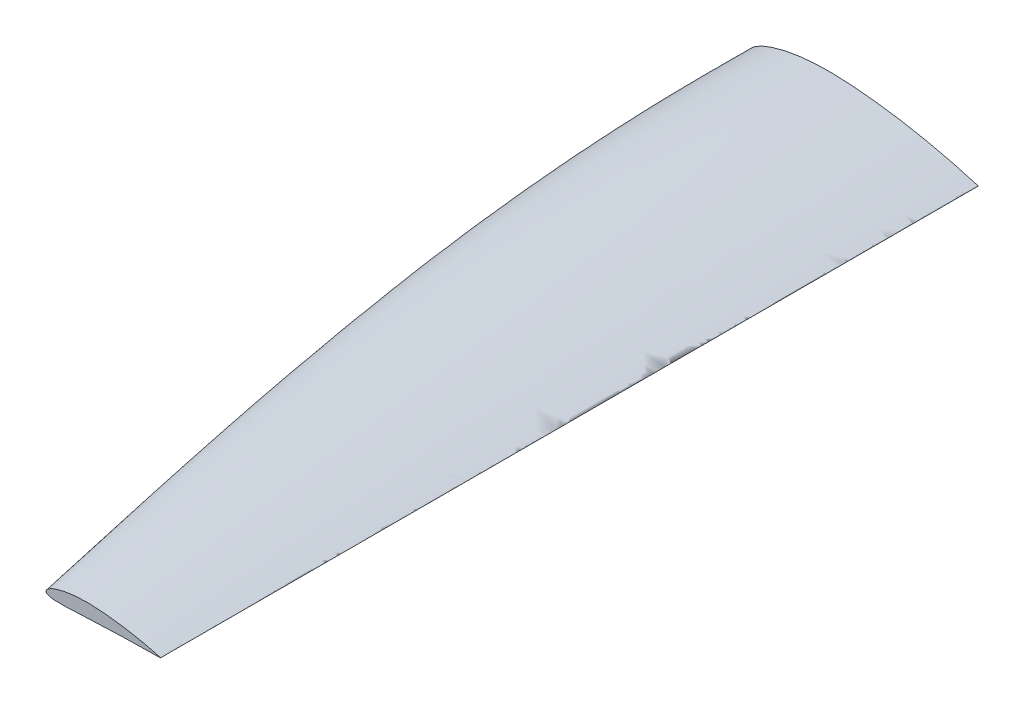
ISO-10303-21;
HEADER;
FILE_DESCRIPTION(('STEP AP214'),'2;1');
FILE_NAME('part.step','',(''),(''),'','','');
FILE_SCHEMA(('AUTOMOTIVE_DESIGN { 1 0 10303 214 1 1 1 1 }'));
ENDSEC;
DATA;
#1=APPLICATION_CONTEXT('core data for automotive mechanical design processes');
#2=APPLICATION_PROTOCOL_DEFINITION('international standard','automotive_design',2000,#1);
#3=PRODUCT_CONTEXT('',#1,'mechanical');
#4=PRODUCT('Part','Part','',(#3));
#5=PRODUCT_RELATED_PRODUCT_CATEGORY('part','',(#4));
#6=PRODUCT_DEFINITION_FORMATION('','',#4);
#7=PRODUCT_DEFINITION_CONTEXT('part definition',#1,'design');
#8=PRODUCT_DEFINITION('design','',#6,#7);
#9=PRODUCT_DEFINITION_SHAPE('','',#8);
#10=(LENGTH_UNIT() NAMED_UNIT(*) SI_UNIT(.MILLI.,.METRE.));
#11=(NAMED_UNIT(*) PLANE_ANGLE_UNIT() SI_UNIT($,.RADIAN.));
#12=(NAMED_UNIT(*) SI_UNIT($,.STERADIAN.) SOLID_ANGLE_UNIT());
#13=UNCERTAINTY_MEASURE_WITH_UNIT(LENGTH_MEASURE(1.E-05),#10,'distance_accuracy_value','');
#14=(GEOMETRIC_REPRESENTATION_CONTEXT(3) GLOBAL_UNCERTAINTY_ASSIGNED_CONTEXT((#13)) GLOBAL_UNIT_ASSIGNED_CONTEXT((#10,
#11,#12)) REPRESENTATION_CONTEXT('',''));
#15=CARTESIAN_POINT('',(0.,0.,0.));
#16=DIRECTION('',(0.,0.,1.));
#17=DIRECTION('',(1.,0.,0.));
#18=AXIS2_PLACEMENT_3D('',#15,#16,#17);
#19=CARTESIAN_POINT('',(0.415671823278239,2.29801966455142,0.));
#20=DIRECTION('',(0.,0.,-1.));
#21=DIRECTION('',(-1.,0.,0.));
#22=AXIS2_PLACEMENT_3D('',#19,#20,#21);
#23=PLANE('',#22);
#24=CARTESIAN_POINT('',(140.02716,0.20398,0.));
#25=CARTESIAN_POINT('',(139.956789164407,0.225221614482339,0.));
#26=CARTESIAN_POINT('',(139.675665524009,0.310079495461963,0.));
#27=CARTESIAN_POINT('',(139.044498575236,0.499628042540923,0.));
#28=CARTESIAN_POINT('',(137.996224381688,0.811560707731416,0.));
#29=CARTESIAN_POINT('',(136.536433819815,1.24004769538334,0.));
#30=CARTESIAN_POINT('',(134.672905149545,1.77703214134827,0.));
#31=CARTESIAN_POINT('',(132.415637549044,2.41285187336849,0.));
#32=CARTESIAN_POINT('',(129.776846288305,3.13588639968204,0.));
#33=CARTESIAN_POINT('',(126.771112785758,3.93369295315949,0.));
#34=CARTESIAN_POINT('',(123.415248342765,4.79279186121189,0.));
#35=CARTESIAN_POINT('',(119.728052254295,5.69839562087959,0.));
#36=CARTESIAN_POINT('',(115.730741779321,6.63628033170199,0.));
#37=CARTESIAN_POINT('',(111.446385502148,7.59123371500353,0.));
#38=CARTESIAN_POINT('',(106.900008862267,8.54811777631246,0.));
#39=CARTESIAN_POINT('',(102.11855960554,9.49244534886887,0.));
#40=CARTESIAN_POINT('',(97.1306342164976,10.4094157862568,0.));
#41=CARTESIAN_POINT('',(91.9664102677575,11.2849755639074,0.));
#42=CARTESIAN_POINT('',(86.6574126094523,12.1050385678699,0.));
#43=CARTESIAN_POINT('',(81.236388980716,12.8570299790795,0.));
#44=CARTESIAN_POINT('',(75.7371009401458,13.5278385740999,0.));
#45=CARTESIAN_POINT('',(70.1942324093874,14.1062599715892,0.));
#46=CARTESIAN_POINT('',(64.6430465460116,14.5819773965765,0.));
#47=CARTESIAN_POINT('',(59.1044988145988,14.9449603694939,0.));
#48=CARTESIAN_POINT('',(53.5949828455513,15.1933641453371,0.));
#49=CARTESIAN_POINT('',(48.1486500652942,15.2539109214711,0.));
#50=CARTESIAN_POINT('',(42.8194940736059,15.1314064960747,0.));
#51=CARTESIAN_POINT('',(37.6645384335811,14.8278117397698,0.));
#52=CARTESIAN_POINT('',(32.721013927537,14.3505845804176,0.));
#53=CARTESIAN_POINT('',(28.0243854111276,13.7112812989703,0.));
#54=CARTESIAN_POINT('',(23.608012874332,12.9240931556622,0.));
#55=CARTESIAN_POINT('',(19.5026211339542,12.0062678345121,0.));
#56=CARTESIAN_POINT('',(15.7359111417993,10.9777061910959,0.));
#57=CARTESIAN_POINT('',(12.3325411815223,9.85913447746707,0.));
#58=CARTESIAN_POINT('',(9.31318480721374,8.67337607412427,0.));
#59=CARTESIAN_POINT('',(6.69490403739945,7.44244006941027,0.));
#60=CARTESIAN_POINT('',(4.4905558444516,6.18766147729643,0.));
#61=CARTESIAN_POINT('',(2.70840114542649,4.92797980027153,0.));
#62=CARTESIAN_POINT('',(1.35228918277038,3.67677063274474,0.));
#63=CARTESIAN_POINT('',(0.422250394410197,2.43914829508015,0.));
#64=CARTESIAN_POINT('',(-0.0704433076460615,1.20187014734243,0.));
#65=CARTESIAN_POINT('',(-0.077377808805779,-0.0155425075349178,0.));
#66=CARTESIAN_POINT('',(0.396195143578908,-1.13486449084059,0.));
#67=CARTESIAN_POINT('',(1.31323794825806,-2.08980898964254,0.));
#68=CARTESIAN_POINT('',(2.61664142607889,-2.89089635641442,0.));
#69=CARTESIAN_POINT('',(4.29704123511491,-3.56317367775761,0.));
#70=CARTESIAN_POINT('',(6.3480018888662,-4.11610254754229,0.));
#71=CARTESIAN_POINT('',(8.75913079835625,-4.55450469711747,0.));
#72=CARTESIAN_POINT('',(11.5160065683426,-4.8826500983735,0.));
#73=CARTESIAN_POINT('',(14.6016276176691,-5.10580988203923,0.));
#74=CARTESIAN_POINT('',(17.9973187831287,-5.23050109456169,0.));
#75=CARTESIAN_POINT('',(21.6830590843005,-5.26478673798973,0.));
#76=CARTESIAN_POINT('',(25.6380804310704,-5.2188970225612,0.));
#77=CARTESIAN_POINT('',(29.840828227253,-5.10415692979439,0.));
#78=CARTESIAN_POINT('',(34.2692146276758,-4.93322913419527,0.));
#79=CARTESIAN_POINT('',(38.9004770271151,-4.72015951338447,0.));
#80=CARTESIAN_POINT('',(43.711199328192,-4.47993319920713,0.));
#81=CARTESIAN_POINT('',(48.6771365915648,-4.22752148181516,0.));
#82=CARTESIAN_POINT('',(53.791929218503,-3.97517312980894,0.));
#83=CARTESIAN_POINT('',(59.0435545788623,-3.74433201324976,0.));
#84=CARTESIAN_POINT('',(64.3997997730417,-3.4807902478649,0.));
#85=CARTESIAN_POINT('',(69.8108585871143,-3.201291868649,0.));
#86=CARTESIAN_POINT('',(75.2301020814417,-2.91426609005164,0.));
#87=CARTESIAN_POINT('',(80.6251958246626,-2.6275528848076,0.));
#88=CARTESIAN_POINT('',(85.9636812748627,-2.34795621616198,0.));
#89=CARTESIAN_POINT('',(91.2130148357345,-2.0804474575052,0.));
#90=CARTESIAN_POINT('',(96.3409170930741,-1.82925450909069,0.));
#91=CARTESIAN_POINT('',(101.315399411902,-1.59671187508793,0.));
#92=CARTESIAN_POINT('',(106.10523935564,-1.38436743609644,0.));
#93=CARTESIAN_POINT('',(110.679963839704,-1.19288029389329,0.));
#94=CARTESIAN_POINT('',(115.010291079431,-1.02158789581474,0.));
#95=CARTESIAN_POINT('',(119.068135991926,-0.869967551339208,0.));
#96=CARTESIAN_POINT('',(122.827026690065,-0.736722937412343,0.));
#97=CARTESIAN_POINT('',(126.262097544598,-0.620892102779046,0.));
#98=CARTESIAN_POINT('',(129.350471616447,-0.521024926129598,0.));
#99=CARTESIAN_POINT('',(132.071299286858,-0.436344517829494,0.));
#100=CARTESIAN_POINT('',(134.406136442625,-0.365638747434759,0.));
#101=CARTESIAN_POINT('',(136.33894196305,-0.308592109231638,0.));
#102=CARTESIAN_POINT('',(137.856451785526,-0.264409061113069,0.));
#103=CARTESIAN_POINT('',(138.948036515316,-0.233117796124669,0.));
#104=CARTESIAN_POINT('',(139.606087823228,-0.214473895954195,0.));
#105=CARTESIAN_POINT('',(139.899386715742,-0.206081722010989,0.));
#106=CARTESIAN_POINT('',(139.97284,-0.20398,0.));
#107=B_SPLINE_CURVE_WITH_KNOTS('',3,(#24,#25,#26,#27,#28,#29,#30,#31,#32,#33,#34,#35,#36,#37,
#38,#39,#40,#41,#42,#43,#44,#45,#46,#47,#48,#49,#50,#51,#52,#53,#54,#55,#56,#57,#58,#59,#60,#61,
#62,#63,#64,#65,#66,#67,#68,#69,#70,#71,#72,#73,#74,#75,#76,#77,#78,#79,#80,#81,#82,#83,#84,#85,
#86,#87,#88,#89,#90,#91,#92,#93,#94,#95,#96,#97,#98,#99,#100,#101,#102,#103,#104,#105,#106),
.UNSPECIFIED.,.F.,.F.,(4,1,1,1,1,1,1,1,1,1,1,1,1,1,1,1,1,1,1,1,1,1,1,1,1,1,1,1,1,1,1,1,1,1,1,1,
1,1,1,1,1,1,1,1,1,1,1,1,1,1,1,1,1,1,1,1,1,1,1,1,1,1,1,1,1,1,1,1,1,1,1,1,1,1,1,1,1,1,1,1,4),(0.,
0.000765130769244524,0.00305661209529914,0.00685965866343209,0.0121494072683618,
0.0188925332976978,0.0270462263354811,0.036559370649623,0.0473717724666816,0.0594157806242667,
0.0726163879325896,0.0868916573026751,0.10215276829467,0.118305464017637,0.135250369014953,
0.152882702447659,0.171093067984952,0.189769869151045,0.208797162579736,0.22805825047004,
0.247433292879836,0.266802990255714,0.286048293434919,0.305204432528419,0.324202365555451,
0.342730632005811,0.36067914332664,0.377940972438308,0.394414282166585,0.410003847372115,
0.424621473054428,0.438187350081377,0.450630882305105,0.461893566430374,0.471931937961665,
0.480721044479205,0.488262835911895,0.494602302954352,0.499854540793154,0.504257180365687,
0.508228707867405,0.512199847689362,0.51658892059262,0.521790216513113,0.528017933142941,
0.535367185905355,0.54386649047139,0.553505568972509,0.564252677358332,0.576059862122198,
0.58886938605381,0.602615469366401,0.617228103730882,0.632630671763226,0.648744088065116,
0.665485527558587,0.68276768508984,0.700501138454311,0.718789846760451,0.737484301576945,
0.75632139416763,0.77518847252562,0.793972092477878,0.812558003919144,0.830832750700832,
0.848683119557139,0.865998140681247,0.882668481494707,0.898589333210652,0.913657957121903,
0.927777935623076,0.940856759647301,0.952808686344022,0.963553789330579,0.973020343249466,
0.981143405483448,0.987868175453762,0.993147615856128,0.996945811456687,0.999235114127682,1.),.UNSPECIFIED.);
#108=CARTESIAN_POINT('',(140.02716,0.20398,0.));
#109=VERTEX_POINT('',#108);
#110=CARTESIAN_POINT('',(0.411412429813606,2.29017223411874,0.));
#111=VERTEX_POINT('',#110);
#112=EDGE_CURVE('E107',#109,#111,#107,.T.);
#113=ORIENTED_EDGE('',*,*,#112,.F.);
#114=CARTESIAN_POINT('',(139.966917755284,0.00440491110149645,0.));
#115=DIRECTION('',(0.,0.,1.));
#116=DIRECTION('',(1.,0.,0.));
#117=AXIS2_PLACEMENT_3D('',#114,#115,#116);
#118=CIRCLE('',#117,0.208469048439458);
#119=CARTESIAN_POINT('',(139.97284,-0.20398,0.));
#120=VERTEX_POINT('',#119);
#121=EDGE_CURVE('E12',#120,#109,#118,.T.);
#122=ORIENTED_EDGE('',*,*,#121,.F.);
#123=EDGE_CURVE('E141',#111,#120,#107,.T.);
#124=ORIENTED_EDGE('',*,*,#123,.F.);
#125=EDGE_LOOP('',(#113,#122,#124));
#126=FACE_BOUND('',#125,.T.);
#127=ADVANCED_FACE('F97',(#126),#23,.T.);
#128=CARTESIAN_POINT('',(70.2070508347638,0.921900595099988,500.));
#129=DIRECTION('',(0.,0.,-1.));
#130=DIRECTION('',(-1.,0.,0.));
#131=AXIS2_PLACEMENT_3D('',#128,#129,#130);
#132=PLANE('',#131);
#133=CARTESIAN_POINT('',(139.991690010155,0.0954049111014893,500.));
#134=CARTESIAN_POINT('',(138.826226199171,0.412670477784435,500.));
#135=CARTESIAN_POINT('',(136.500922951398,1.04567052949012,500.));
#136=CARTESIAN_POINT('',(131.84266656573,2.19662076893469,500.));
#137=CARTESIAN_POINT('',(126.017356406259,3.46828079525896,500.));
#138=CARTESIAN_POINT('',(119.010615610135,4.72183337190155,500.));
#139=CARTESIAN_POINT('',(112.009306596785,5.74935607308087,500.));
#140=CARTESIAN_POINT('',(105.004096516577,6.48228745980126,500.));
#141=CARTESIAN_POINT('',(97.9994968079689,6.93940968050786,500.));
#142=CARTESIAN_POINT('',(92.1519728350144,6.94403278194451,500.));
#143=CARTESIAN_POINT('',(87.4830557257147,6.62102156808662,500.));
#144=CARTESIAN_POINT('',(83.9766368401042,6.19555764960619,500.));
#145=CARTESIAN_POINT('',(80.4626396313168,5.56812181580328,500.));
#146=CARTESIAN_POINT('',(77.5507139927825,4.81354122844692,500.));
#147=CARTESIAN_POINT('',(75.2172346664348,4.05144626835453,500.));
#148=CARTESIAN_POINT('',(73.4577373117885,3.33199340289161,500.));
#149=CARTESIAN_POINT('',(71.956438297883,2.55392412828517,500.));
#150=CARTESIAN_POINT('',(70.653309522438,1.62321606752932,500.));
#151=CARTESIAN_POINT('',(69.5189274646735,0.126342995005206,500.));
#152=CARTESIAN_POINT('',(70.7433436229241,-1.0184347501925,500.));
#153=CARTESIAN_POINT('',(71.9927392558483,-1.46780258624416,500.));
#154=CARTESIAN_POINT('',(73.4806835291226,-1.77110609035672,500.));
#155=CARTESIAN_POINT('',(75.2379420284311,-1.92531408335775,500.));
#156=CARTESIAN_POINT('',(77.5740531760367,-2.0344501162058,500.));
#157=CARTESIAN_POINT('',(80.4924205235268,-2.02627575318249,500.));
#158=CARTESIAN_POINT('',(83.9932091133849,-1.92831199445039,500.));
#159=CARTESIAN_POINT('',(87.4915275698006,-1.74178242167589,500.));
#160=CARTESIAN_POINT('',(92.1582125342315,-1.52352499743364,500.));
#161=CARTESIAN_POINT('',(97.9905725641301,-1.24344192758375,500.));
#162=CARTESIAN_POINT('',(104.991891895179,-0.980441739602082,500.));
#163=CARTESIAN_POINT('',(111.990962082237,-0.688402450579421,500.));
#164=CARTESIAN_POINT('',(118.990701977773,-0.439659860819063,500.));
#165=CARTESIAN_POINT('',(125.991002641338,-0.256694079996228,500.));
#166=CARTESIAN_POINT('',(131.824848171958,-0.163797089782725,500.));
#167=CARTESIAN_POINT('',(136.491583614441,-0.102619622635028,500.));
#168=CARTESIAN_POINT('',(138.825008877188,-0.0919365040045917,500.));
#169=CARTESIAN_POINT('',(139.991690010155,-0.0865950888984963,500.));
#170=B_SPLINE_CURVE_WITH_KNOTS('',3,(#133,#134,#135,#136,#137,#138,#139,#140,#141,#142,#143,
#144,#145,#146,#147,#148,#149,#150,#151,#152,#153,#154,#155,#156,#157,#158,#159,#160,#161,#162,
#163,#164,#165,#166,#167,#168,#169),.UNSPECIFIED.,.F.,.F.,(4,1,1,1,1,1,1,1,1,1,1,1,1,1,1,1,1,1,
1,1,1,1,1,1,1,1,1,1,1,1,1,1,1,1,4),(0.,0.0253048857109568,0.0504876533905407,0.100520432651506,
0.150190715723339,0.199586606894546,0.248740009224029,0.297715538989186,0.346600594361287,
0.371102737044854,0.395726297170324,0.420570145356384,0.445825119255769,0.458702215791061,
0.471919981785349,0.485786002851729,0.493461050828321,0.506863029175844,0.516147770049506,
0.522766002591757,0.535269014058866,0.54755113395783,0.559786370715185,0.584228898401235,
0.608680810066395,0.633151283581104,0.657621757095813,0.706558114036031,0.755481870433228,
0.804405626830425,0.853320223819576,0.902221408341012,0.951113135961066,0.975557227893806,1.),.UNSPECIFIED.);
#171=CARTESIAN_POINT('',(139.991690010155,0.0954049111014926,500.));
#172=VERTEX_POINT('',#171);
#173=CARTESIAN_POINT('',(70.229202467087,0.958305058133424,500.));
#174=VERTEX_POINT('',#173);
#175=EDGE_CURVE('E149',#172,#174,#170,.T.);
#176=ORIENTED_EDGE('',*,*,#175,.T.);
#177=CARTESIAN_POINT('',(139.991690010155,-0.0865950888984997,500.));
#178=VERTEX_POINT('',#177);
#179=EDGE_CURVE('E138',#174,#178,#170,.T.);
#180=ORIENTED_EDGE('',*,*,#179,.T.);
#181=CARTESIAN_POINT('',(139.966917755284,0.00440491110149645,500.));
#182=DIRECTION('',(0.,0.,1.));
#183=DIRECTION('',(1.,0.,0.));
#184=AXIS2_PLACEMENT_3D('',#181,#182,#183);
#185=CIRCLE('',#184,0.0943115295781594);
#186=EDGE_CURVE('E146',#178,#172,#185,.T.);
#187=ORIENTED_EDGE('',*,*,#186,.T.);
#188=EDGE_LOOP('',(#176,#180,#187));
#189=FACE_BOUND('',#188,.T.);
#190=ADVANCED_FACE('F157',(#189),#132,.F.);
#191=CARTESIAN_POINT('',(70.229202467087,0.958305058133424,500.));
#192=CARTESIAN_POINT('',(36.2046741632112,1.60736817517169,346.235262809342));
#193=CARTESIAN_POINT('',(-0.618435955305731,2.30981796137034,179.823085119535));
#194=CARTESIAN_POINT('',(0.338671594634367,2.29155986226734,12.7013661283614));
#195=CARTESIAN_POINT('',(0.411412429813606,2.29017223411874,0.));
#196=CARTESIAN_POINT('',(70.2782998015312,1.03770981875317,500.));
#197=CARTESIAN_POINT('',(36.2728825393325,1.72882028354048,346.235262809341));
#198=CARTESIAN_POINT('',(-0.529544618178424,2.47677589137837,179.823085119535));
#199=CARTESIAN_POINT('',(0.42702533952489,2.45733500338771,12.7013661283614));
#200=CARTESIAN_POINT('',(0.499725317322645,2.45585748246631,0.));
#201=CARTESIAN_POINT('',(70.3848431585398,1.1911445888186,500.));
#202=CARTESIAN_POINT('',(36.4223219029815,1.96397379063561,346.235262809341));
#203=CARTESIAN_POINT('',(-0.333680970199578,2.80036965620507,179.823085119535));
#204=CARTESIAN_POINT('',(0.621682325902105,2.77863002598104,12.7013661283614));
#205=CARTESIAN_POINT('',(0.694290596584305,2.77697779906142,0.));
#206=CARTESIAN_POINT('',(70.6235984634688,1.47841747586088,500.));
#207=CARTESIAN_POINT('',(36.7622058985501,2.40584772455573,346.235262809341));
#208=CARTESIAN_POINT('',(0.115649742111272,3.40956086555595,179.823085119535));
#209=CARTESIAN_POINT('',(1.06816829537149,3.38347231893038,12.7013661283614));
#210=CARTESIAN_POINT('',(1.14056036363195,3.38148957135904,0.));
#211=CARTESIAN_POINT('',(70.9554526420563,1.80768321475091,500.));
#212=CARTESIAN_POINT('',(37.2430421208917,2.91141458797067,346.235262809342));
#213=CARTESIAN_POINT('',(0.757722063123896,4.10592995448357,179.823085119535));
#214=CARTESIAN_POINT('',(1.70604976213893,4.07488206982284,12.7013661283614));
#215=CARTESIAN_POINT('',(1.77812332258078,4.07252240913381,0.));
#216=CARTESIAN_POINT('',(71.3955978319423,2.15497504855435,499.999999999999));
#217=CARTESIAN_POINT('',(37.8797469829841,3.45350800704475,346.235262809341));
#218=CARTESIAN_POINT('',(1.6071540022788,4.85884775770834,179.823085119535));
#219=CARTESIAN_POINT('',(2.54995249175998,4.82232011837365,12.7013661283614));
#220=CARTESIAN_POINT('',(2.62160582845645,4.81954399254275,0.));
#221=CARTESIAN_POINT('',(71.8655041793206,2.46013808728523,500.));
#222=CARTESIAN_POINT('',(38.5577776365189,3.9422480503331,346.235262809342));
#223=CARTESIAN_POINT('',(2.51042757984461,5.54626436143786,179.823085119535));
#224=CARTESIAN_POINT('',(3.44737154746529,5.50457271408258,12.7013661283614));
#225=CARTESIAN_POINT('',(3.51857993645475,5.50140412007368,0.));
#226=CARTESIAN_POINT('',(72.3487042791655,2.74309618260897,500.));
#227=CARTESIAN_POINT('',(39.2612225484475,4.39316593948097,346.235262809341));
#228=CARTESIAN_POINT('',(3.45223285627134,6.17895705516884,179.823085119535));
#229=CARTESIAN_POINT('',(4.38298135306586,6.13254071081498,12.7013661283613));
#230=CARTESIAN_POINT('',(4.45371888199132,6.1290130365693,0.));
#231=CARTESIAN_POINT('',(72.8436759051862,3.00518095133652,500.));
#232=CARTESIAN_POINT('',(39.9844704090411,4.8118253667572,346.235262809342));
#233=CARTESIAN_POINT('',(4.42253310354455,6.76706970283991,179.823085119535));
#234=CARTESIAN_POINT('',(5.34686020617218,6.71624892452923,12.7013661283614));
#235=CARTESIAN_POINT('',(5.41710970470362,6.71238651025927,0.));
#236=CARTESIAN_POINT('',(73.3469083408627,3.25072178685246,500.));
#237=CARTESIAN_POINT('',(40.7228944701559,5.20293922871664,346.235262809341));
#238=CARTESIAN_POINT('',(5.4154937461842,7.31573024803741,179.823085119535));
#239=CARTESIAN_POINT('',(6.33320492519405,7.26081451089492,12.7013661283613));
#240=CARTESIAN_POINT('',(6.40295160895878,7.25664087692402,0.));
#241=CARTESIAN_POINT('',(73.8567047415157,3.48243752701308,500.));
#242=CARTESIAN_POINT('',(41.4732762917044,5.57076411799576,346.235262809342));
#243=CARTESIAN_POINT('',(6.42624959459422,7.83085952141749,179.823085119535));
#244=CARTESIAN_POINT('',(7.33719312290549,7.77211504363607,12.7013661283614));
#245=CARTESIAN_POINT('',(7.40642546054052,7.76765042273087,0.));
#246=CARTESIAN_POINT('',(74.3720706754173,3.70136382823638,500.));
#247=CARTESIAN_POINT('',(42.2336666313503,5.9173857426868,346.235262809341));
#248=CARTESIAN_POINT('',(7.45181806085116,8.31567965148315,179.823085119535));
#249=CARTESIAN_POINT('',(8.35586907013724,8.25334311337715,12.7013661283614));
#250=CARTESIAN_POINT('',(8.42457757156346,8.24860549340508,0.));
#251=CARTESIAN_POINT('',(75.0660837989668,3.9766777895471,500.));
#252=CARTESIAN_POINT('',(43.2590404393751,6.35352196504256,346.235262809341));
#253=CARTESIAN_POINT('',(8.83580759645965,8.92586607007032,179.823085119535));
#254=CARTESIAN_POINT('',(9.73053745336906,8.85900561325279,12.7013661283614));
#255=CARTESIAN_POINT('',(9.79853754077352,8.85392417233252,0.));
#256=CARTESIAN_POINT('',(75.9451241706557,4.29052694306,500.));
#257=CARTESIAN_POINT('',(44.5592773307596,6.85343943563412,346.235262809342));
#258=CARTESIAN_POINT('',(10.5918852180306,9.62715632879172,179.823085119535));
#259=CARTESIAN_POINT('',(11.4747668469378,9.55506178351043,12.7013661283614));
#260=CARTESIAN_POINT('',(11.5418664608267,9.54958254825002,0.));
#261=CARTESIAN_POINT('',(77.0127881359414,4.6287653700319,500.));
#262=CARTESIAN_POINT('',(46.14133161017,7.39307171940913,346.235262809341));
#263=CARTESIAN_POINT('',(12.7306393879359,10.3847474950536,179.823085119535));
#264=CARTESIAN_POINT('',(13.599051254063,10.3069877549711,12.7013661283614));
#265=CARTESIAN_POINT('',(13.6650511559817,10.3010779609911,0.));
#266=CARTESIAN_POINT('',(78.0886348624186,4.9397707511314,500.));
#267=CARTESIAN_POINT('',(47.7394805412324,7.88307813391408,346.235262809341));
#268=CARTESIAN_POINT('',(14.8940508679106,11.0684781165644,179.823085119535));
#269=CARTESIAN_POINT('',(15.7477704103442,10.9856830902029,12.7013661283614));
#270=CARTESIAN_POINT('',(15.8126536855094,10.9793906109861,0.));
#271=CARTESIAN_POINT('',(79.1719079570255,5.22391372818469,500.));
#272=CARTESIAN_POINT('',(49.3509977531507,8.32725356886612,346.235262809341));
#273=CARTESIAN_POINT('',(17.0772612750289,11.6858489817987,179.823085119535));
#274=CARTESIAN_POINT('',(17.9161213481886,11.5985522538318,12.7013661283614));
#275=CARTESIAN_POINT('',(17.9798752934208,11.5919176421822,0.));
#276=CARTESIAN_POINT('',(80.2618450255349,5.48132242440709,500.));
#277=CARTESIAN_POINT('',(50.9737359771467,8.72852157261701,346.235262809342));
#278=CARTESIAN_POINT('',(19.2766245574104,12.2428089932502,179.823085119535));
#279=CARTESIAN_POINT('',(20.1004969721379,12.1514655132421,12.7013661283614));
#280=CARTESIAN_POINT('',(20.1631118449724,12.144523345641,0.));
#281=CARTESIAN_POINT('',(81.3576836737197,5.71212496301391,500.));
#282=CARTESIAN_POINT('',(52.6059220897091,9.08926353480711,346.235262809341));
#283=CARTESIAN_POINT('',(21.4892737278636,12.7441781424099,179.823085119535));
#284=CARTESIAN_POINT('',(22.2980587267433,12.6491794757013,12.7013661283613));
#285=CARTESIAN_POINT('',(22.3595269455476,12.6419595113852,0.));
#286=CARTESIAN_POINT('',(82.8253426390902,5.98719317444323,500.));
#287=CARTESIAN_POINT('',(54.7927186249984,9.51997199111621,346.235262809342));
#288=CARTESIAN_POINT('',(24.4543582585361,13.3433285481532,179.823085119535));
#289=CARTESIAN_POINT('',(25.2429139689605,13.2439517324775,12.7013661283614));
#290=CARTESIAN_POINT('',(25.3028447478633,13.2363990258144,0.));
#291=CARTESIAN_POINT('',(84.6696902758299,6.27503693259471,500.));
#292=CARTESIAN_POINT('',(57.5423910216289,9.97063484910298,346.235262809341));
#293=CARTESIAN_POINT('',(28.1838200890933,13.9702026849293,179.823085119535));
#294=CARTESIAN_POINT('',(28.9469090787126,13.8662457796096,12.7013661283613));
#295=CARTESIAN_POINT('',(29.0049043692361,13.8583449829687,0.));
#296=CARTESIAN_POINT('',(86.8933665788703,6.54445573877857,499.999999999999));
#297=CARTESIAN_POINT('',(60.85983606538,10.3877064069691,346.235262809341));
#298=CARTESIAN_POINT('',(32.6849984214789,14.5470717126071,179.823085119536));
#299=CARTESIAN_POINT('',(33.417319774578,14.4389613459333,12.7013661283614));
#300=CARTESIAN_POINT('',(33.4729767034648,14.4307448833592,0.));
#301=CARTESIAN_POINT('',(89.1248330333566,6.7389668396313,500.000000000001));
#302=CARTESIAN_POINT('',(64.189772125802,10.6884748659797,346.235262809342));
#303=CARTESIAN_POINT('',(37.2037552908172,14.9628373984833,179.823085119535));
#304=CARTESIAN_POINT('',(37.9051767723934,14.8517380199171,12.7013661283613));
#305=CARTESIAN_POINT('',(37.9584852896919,14.8432943903738,0.));
#306=CARTESIAN_POINT('',(91.3612245173043,6.86341742493875,499.999999999999));
#307=CARTESIAN_POINT('',(67.5276567895569,10.8813061359339,346.235262809341));
#308=CARTESIAN_POINT('',(41.7337330320305,15.229673793747,179.823085119535));
#309=CARTESIAN_POINT('',(42.4041695891667,15.1166508714079,12.7013661283614));
#310=CARTESIAN_POINT('',(42.4551232307965,15.1080610512087,0.));
#311=CARTESIAN_POINT('',(93.6002759941808,6.92201815265129,500.000000000001));
#312=CARTESIAN_POINT('',(70.8697883122069,10.9721818402884,346.235262809342));
#313=CARTESIAN_POINT('',(46.2696750208325,15.3554791526244,179.823085119535));
#314=CARTESIAN_POINT('',(46.9090820151025,15.2415483374986,12.7013661283614));
#315=CARTESIAN_POINT('',(46.9576773885123,15.2328895168202,0.));
#316=CARTESIAN_POINT('',(95.840015243494,6.92177761914216,500.));
#317=CARTESIAN_POINT('',(74.2131483548572,10.9706687655277,346.235262809341));
#318=CARTESIAN_POINT('',(50.8074307547086,15.352588867687,179.823085119535));
#319=CARTESIAN_POINT('',(51.4157929749221,15.2386938490557,12.7013661283614));
#320=CARTESIAN_POINT('',(51.4620289240509,15.2300377489356,0.));
#321=CARTESIAN_POINT('',(98.079090879165,6.86913463458884,500.));
#322=CARTESIAN_POINT('',(77.5551624367505,10.8787735482608,346.235262809341));
#323=CARTESIAN_POINT('',(55.343102056372,15.2182128473154,179.823085119535));
#324=CARTESIAN_POINT('',(55.9204386969045,15.1054219911855,12.7013661283614));
#325=CARTESIAN_POINT('',(55.9643166805382,15.0968498081785,0.));
#326=CARTESIAN_POINT('',(100.31656163525,6.77067623720315,500.000000000001));
#327=CARTESIAN_POINT('',(80.89416932469,10.7123386969354,346.235262809342));
#328=CARTESIAN_POINT('',(59.8742485067046,14.9782103501278,179.823085119535));
#329=CARTESIAN_POINT('',(60.4205990145592,14.8673316667899,12.7013661283614));
#330=CARTESIAN_POINT('',(60.4621220306972,14.8589048102364,0.));
#331=CARTESIAN_POINT('',(102.551877149857,6.6322433124614,500.));
#332=CARTESIAN_POINT('',(84.2299980066236,10.4919185104892,346.235262809341));
#333=CARTESIAN_POINT('',(64.4011096457357,14.6690592946127,179.823085119535));
#334=CARTESIAN_POINT('',(64.9165027968314,14.5604869070882,12.7013661283614));
#335=CARTESIAN_POINT('',(64.9556730324634,14.5522353306102,0.));
#336=CARTESIAN_POINT('',(104.784754762866,6.45956051923418,500.));
#337=CARTESIAN_POINT('',(87.5618189523496,10.2173307640174,346.235262809341));
#338=CARTESIAN_POINT('',(68.9222640920828,14.2841847197261,179.823085119535));
#339=CARTESIAN_POINT('',(69.4067440457549,14.1784789112546,12.7013661283614));
#340=CARTESIAN_POINT('',(69.443564857021,14.1704451967655,0.));
#341=CARTESIAN_POINT('',(107.015252724562,6.25879410543564,500.));
#342=CARTESIAN_POINT('',(90.8893967662869,9.89600905633013,346.235262809341));
#343=CARTESIAN_POINT('',(73.4371586513715,13.8323918171823,179.823085119535));
#344=CARTESIAN_POINT('',(73.8907778271927,13.7300772205135,12.7013661283614));
#345=CARTESIAN_POINT('',(73.9252531980166,13.7223012404649,0.));
#346=CARTESIAN_POINT('',(109.243020263828,6.02991509345569,499.999999999999));
#347=CARTESIAN_POINT('',(94.2122172685744,9.52870353414219,346.235262809341));
#348=CARTESIAN_POINT('',(77.9451022943184,13.3152739424707,179.823085119535));
#349=CARTESIAN_POINT('',(78.3679177085377,13.2168532736427,12.7013661283614));
#350=CARTESIAN_POINT('',(78.4000519721937,13.2093732348008,0.));
#351=CARTESIAN_POINT('',(111.467630217193,5.77233653855922,500.000000000001));
#352=CARTESIAN_POINT('',(97.529783862887,9.11684378136753,346.235262809342));
#353=CARTESIAN_POINT('',(82.4455232807614,12.7364430714502,179.823085119535));
#354=CARTESIAN_POINT('',(82.8375939027688,12.6423623216943,12.7013661283614));
#355=CARTESIAN_POINT('',(82.8673915409714,12.6352121197008,0.));
#356=CARTESIAN_POINT('',(113.688629608729,5.48551481786011,500.));
#357=CARTESIAN_POINT('',(100.841613888962,8.66112100559334,346.235262809341));
#358=CARTESIAN_POINT('',(86.9379068245091,12.0979268093236,179.823085119535));
#359=CARTESIAN_POINT('',(87.2992924587131,12.008597234178,12.7013661283614));
#360=CARTESIAN_POINT('',(87.3267580166385,12.0018081247381,0.));
#361=CARTESIAN_POINT('',(115.905835851736,5.17099068729486,500.));
#362=CARTESIAN_POINT('',(104.147403401136,8.16360264791981,346.235262809341));
#363=CARTESIAN_POINT('',(91.4218176389296,11.4023626032057,179.823085119535));
#364=CARTESIAN_POINT('',(91.7525815035574,11.3181806425926,12.7013661283614));
#365=CARTESIAN_POINT('',(91.7777197858347,11.3117827554143,0.));
#366=CARTESIAN_POINT('',(118.857168320026,4.71825402701808,500.));
#367=CARTESIAN_POINT('',(108.546800856844,7.44709981848951,346.235262809342));
#368=CARTESIAN_POINT('',(97.3883861664675,10.4003983382623,179.823085119535));
#369=CARTESIAN_POINT('',(97.6784160664718,10.3236361011399,12.7013661283614));
#370=CARTESIAN_POINT('',(97.7004585392896,10.3178021180741,0.));
#371=CARTESIAN_POINT('',(122.537282317763,4.09644740312586,500.));
#372=CARTESIAN_POINT('',(114.029986302646,6.45713778357876,346.235262809341));
#373=CARTESIAN_POINT('',(104.822949097673,9.01199941336477,179.823085119535));
#374=CARTESIAN_POINT('',(105.062258726683,8.9455933616475,12.7013661283614));
#375=CARTESIAN_POINT('',(105.080446423857,8.94054645582885,0.));
#376=CARTESIAN_POINT('',(126.936679408333,3.25646426285069,500.));
#377=CARTESIAN_POINT('',(120.581113383964,5.11956420060271,346.235262809341));
#378=CARTESIAN_POINT('',(113.702790031744,7.13590763252119,179.823085119535));
#379=CARTESIAN_POINT('',(113.881571649868,7.0834987644014,12.7013661283614));
#380=CARTESIAN_POINT('',(113.895159176387,7.07951565420854,0.));
#381=CARTESIAN_POINT('',(131.313562708927,2.30794084316254,500.));
#382=CARTESIAN_POINT('',(127.098152060911,3.62520799826534,346.235262809341));
#383=CARTESIAN_POINT('',(122.536015913119,5.0508228686508,179.823085119535));
#384=CARTESIAN_POINT('',(122.654595113433,5.01376823770405,12.7013661283614));
#385=CARTESIAN_POINT('',(122.663607214598,5.01095206014648,0.));
#386=CARTESIAN_POINT('',(135.669569969635,1.26716975219558,500.));
#387=CARTESIAN_POINT('',(133.57943977534,1.98226901065913,346.235262809341));
#388=CARTESIAN_POINT('',(131.317392418823,2.75618653583092,179.823085119535));
#389=CARTESIAN_POINT('',(131.376187631836,2.73607084478828,12.7013661283614));
#390=CARTESIAN_POINT('',(131.380656108654,2.73454203836863,0.));
#391=CARTESIAN_POINT('',(138.551467093873,0.487466110580543,500.));
#392=CARTESIAN_POINT('',(137.869600576737,0.772215546327786,346.235262809341));
#393=CARTESIAN_POINT('',(137.131649248732,1.08038616180438,179.823085119535));
#394=CARTESIAN_POINT('',(137.150830105135,1.07237618052379,12.7013661283614));
#395=CARTESIAN_POINT('',(137.152287863476,1.07176741641138,0.));
#396=CARTESIAN_POINT('',(140.013951622918,0.0893447974179523,500.));
#397=CARTESIAN_POINT('',(140.042043873624,0.138673611532126,346.235262809341));
#398=CARTESIAN_POINT('',(140.07244676509,0.192059813918808,179.823085119535));
#399=CARTESIAN_POINT('',(140.071656532085,0.190672197902603,12.7013661283614));
#400=CARTESIAN_POINT('',(140.071596473831,0.190566738126496,0.));
#401=CARTESIAN_POINT('',(140.049148717873,0.0626938574956833,500.));
#402=CARTESIAN_POINT('',(140.100754282659,0.0961902275566948,346.235262809341));
#403=CARTESIAN_POINT('',(140.156604502767,0.132441737417794,179.823085119535));
#404=CARTESIAN_POINT('',(140.155152841917,0.131499486921486,12.7013661283614));
#405=CARTESIAN_POINT('',(140.155042514689,0.131427875232649,0.));
#406=CARTESIAN_POINT('',(140.067273718759,0.00435035751677042,500.));
#407=CARTESIAN_POINT('',(140.12854976964,-0.010293936621067,346.235262809342));
#408=CARTESIAN_POINT('',(140.194865891618,-0.0261427516532539,179.823085119535));
#409=CARTESIAN_POINT('',(140.193142200685,-0.0257308087055754,12.7013661283614));
#410=CARTESIAN_POINT('',(140.193011198983,-0.0256995007568896,0.));
#411=CARTESIAN_POINT('',(140.049131733147,-0.0538738984168414,500.));
#412=CARTESIAN_POINT('',(140.081353922622,-0.10920749666964,346.235262809341));
#413=CARTESIAN_POINT('',(140.116226448133,-0.169092388049146,179.823085119535));
#414=CARTESIAN_POINT('',(140.115320040245,-0.167535857884198,12.7013661283614));
#415=CARTESIAN_POINT('',(140.11525115262,-0.167417560516063,0.));
#416=CARTESIAN_POINT('',(140.013951622918,-0.0805349752149594,500.));
#417=CARTESIAN_POINT('',(140.016527863929,-0.140051229158145,346.235262809341));
#418=CARTESIAN_POINT('',(140.019316005637,-0.20446280757059,179.823085119535));
#419=CARTESIAN_POINT('',(140.019243536161,-0.202788619599946,12.7013661283614));
#420=CARTESIAN_POINT('',(140.019238028431,-0.202661380157274,0.));
#421=CARTESIAN_POINT('',(139.991690010155,-0.0865950888984997,500.));
#422=CARTESIAN_POINT('',(139.982503774044,-0.143800655389343,346.235262809341));
#423=CARTESIAN_POINT('',(139.972561952636,-0.205711487935535,179.823085119535));
#424=CARTESIAN_POINT('',(139.972820360801,-0.204102299437814,12.7013661283614));
#425=CARTESIAN_POINT('',(139.97284,-0.20398,0.));
#426=B_SPLINE_SURFACE_WITH_KNOTS('',3,3,((#191,#192,#193,#194,#195),(#196,#197,#198,#199,#200),
(#201,#202,#203,#204,#205),(#206,#207,#208,#209,#210),(#211,#212,#213,#214,#215),(#216,#217,
#218,#219,#220),(#221,#222,#223,#224,#225),(#226,#227,#228,#229,#230),(#231,#232,#233,#234,
#235),(#236,#237,#238,#239,#240),(#241,#242,#243,#244,#245),(#246,#247,#248,#249,#250),(#251,
#252,#253,#254,#255),(#256,#257,#258,#259,#260),(#261,#262,#263,#264,#265),(#266,#267,#268,#269,
#270),(#271,#272,#273,#274,#275),(#276,#277,#278,#279,#280),(#281,#282,#283,#284,#285),(#286,
#287,#288,#289,#290),(#291,#292,#293,#294,#295),(#296,#297,#298,#299,#300),(#301,#302,#303,#304,
#305),(#306,#307,#308,#309,#310),(#311,#312,#313,#314,#315),(#316,#317,#318,#319,#320),(#321,
#322,#323,#324,#325),(#326,#327,#328,#329,#330),(#331,#332,#333,#334,#335),(#336,#337,#338,#339,
#340),(#341,#342,#343,#344,#345),(#346,#347,#348,#349,#350),(#351,#352,#353,#354,#355),(#356,
#357,#358,#359,#360),(#361,#362,#363,#364,#365),(#366,#367,#368,#369,#370),(#371,#372,#373,#374,
#375),(#376,#377,#378,#379,#380),(#381,#382,#383,#384,#385),(#386,#387,#388,#389,#390),(#391,
#392,#393,#394,#395),(#396,#397,#398,#399,#400),(#401,#402,#403,#404,#405),(#406,#407,#408,#409,
#410),(#411,#412,#413,#414,#415),(#416,#417,#418,#419,#420),(#421,#422,#423,#424,#425)),
.UNSPECIFIED.,.F.,.F.,.F.,(4,1,1,1,1,1,1,1,1,1,1,1,1,1,1,1,1,1,1,1,1,1,1,1,1,1,1,1,1,1,1,1,1,1,
1,1,1,1,1,2,1,1,1,4),(4,1,4),(0.499035819548932,0.500985178219045,0.502934536889158,
0.506833254229384,0.51073197156961,0.514630688909836,0.518529406250062,0.522428123590288,
0.526326840930514,0.53022555827074,0.534124275610966,0.538022992951192,0.545820427631644,
0.553617862312096,0.561415296992549,0.569212731673001,0.577010166353452,0.584807601033905,
0.592605035714357,0.608199905075261,0.623794774436165,0.639389643797069,0.654984513157973,
0.670579382518877,0.686174251879782,0.701769121240685,0.71736399060159,0.732958859962494,
0.748553729323398,0.764148598684302,0.779743468045206,0.79533833740611,0.810933206767014,
0.826528076127919,0.842122945488822,0.873312684210631,0.904502422932439,0.935692161654247,
0.966881900376055,0.998071639097864,0.998553729323398,0.999035819548932,0.999517909774466,1.),
(0.,0.923999308976518,1.),.UNSPECIFIED.);
#427=CARTESIAN_POINT('',(139.991690010155,-0.0865950888984963,500.));
#428=CARTESIAN_POINT('',(139.982503774044,-0.143800655389341,346.235262809341));
#429=CARTESIAN_POINT('',(139.972561952636,-0.205711487935535,179.823085119535));
#430=CARTESIAN_POINT('',(139.972820360801,-0.204102299437814,12.7013661283614));
#431=CARTESIAN_POINT('',(139.97284,-0.20398,0.));
#432=B_SPLINE_CURVE_WITH_KNOTS('',3,(#427,#428,#429,#430,#431),.UNSPECIFIED.,.F.,.F.,(4,1,4),
(0.,0.923999308976518,1.),.UNSPECIFIED.);
#433=EDGE_CURVE('E133',#178,#120,#432,.T.);
#434=CARTESIAN_POINT('',(70.229202467087,0.958305058133424,500.));
#435=CARTESIAN_POINT('',(36.2046741632112,1.60736817517169,346.235262809342));
#436=CARTESIAN_POINT('',(-0.618435955305731,2.30981796137034,179.823085119535));
#437=CARTESIAN_POINT('',(0.338671594634367,2.29155986226734,12.7013661283614));
#438=CARTESIAN_POINT('',(0.411412429813606,2.29017223411874,0.));
#439=B_SPLINE_CURVE_WITH_KNOTS('',3,(#434,#435,#436,#437,#438),.UNSPECIFIED.,.F.,.F.,(4,1,4),
(0.,0.923999308976518,1.),.UNSPECIFIED.);
#440=EDGE_CURVE('E143',#174,#111,#439,.T.);
#441=ORIENTED_EDGE('',*,*,#175,.F.);
#442=ORIENTED_EDGE('',*,*,#186,.F.);
#443=ORIENTED_EDGE('',*,*,#433,.T.);
#444=ORIENTED_EDGE('',*,*,#121,.T.);
#445=ORIENTED_EDGE('',*,*,#112,.T.);
#446=ORIENTED_EDGE('',*,*,#440,.F.);
#447=EDGE_LOOP('',(#441,#442,#443,#444,#445,#446));
#448=FACE_BOUND('',#447,.T.);
#449=ADVANCED_FACE('F148',(#448),#426,.T.);
#450=CARTESIAN_POINT('',(139.991690010155,-0.0865950888984963,500.));
#451=CARTESIAN_POINT('',(139.982503774044,-0.143800655389341,346.235262809341));
#452=CARTESIAN_POINT('',(139.972561952636,-0.205711487935535,179.823085119535));
#453=CARTESIAN_POINT('',(139.972820360801,-0.204102299437814,12.7013661283614));
#454=CARTESIAN_POINT('',(139.97284,-0.20398,0.));
#455=CARTESIAN_POINT('',(138.499072398725,-0.0934287386696547,500.));
#456=CARTESIAN_POINT('',(137.754430564559,-0.189160852701694,346.235262809341));
#457=CARTESIAN_POINT('',(136.94854053095,-0.292767114202126,179.823085119535));
#458=CARTESIAN_POINT('',(136.969487252536,-0.290074176675014,12.7013661283614));
#459=CARTESIAN_POINT('',(136.971079217851,-0.289869511562071,0.));
#460=CARTESIAN_POINT('',(135.513793490297,-0.110875964207497,500.));
#461=CARTESIAN_POINT('',(133.298347364737,-0.283504732476394,346.235262809342));
#462=CARTESIAN_POINT('',(130.900676604556,-0.470332543484295,179.823085119535));
#463=CARTESIAN_POINT('',(130.962996945761,-0.465476508568208,12.7013661283614));
#464=CARTESIAN_POINT('',(130.967733334758,-0.465107446558951,0.));
#465=CARTESIAN_POINT('',(131.036103322669,-0.177281765470207,500.));
#466=CARTESIAN_POINT('',(126.614913355553,-0.46200513265204,346.235262809341));
#467=CARTESIAN_POINT('',(121.830072150408,-0.770147535374409,179.823085119535));
#468=CARTESIAN_POINT('',(121.954439908263,-0.762138287400704,12.7013661283614));
#469=CARTESIAN_POINT('',(121.963891943801,-0.761529579020124,0.));
#470=CARTESIAN_POINT('',(126.558420852209,-0.251331605100519,499.999999999999));
#471=CARTESIAN_POINT('',(119.932211901879,-0.662885899198975,346.235262809341));
#472=CARTESIAN_POINT('',(112.760984731083,-1.10829131249341,179.823085119535));
#473=CARTESIAN_POINT('',(112.947379515375,-1.09671431960833,12.7013661283614));
#474=CARTESIAN_POINT('',(112.961545647784,-1.09583446014909,0.));
#475=CARTESIAN_POINT('',(122.827389810974,-0.339859245408525,500.000000000001));
#476=CARTESIAN_POINT('',(114.364227214257,-0.861454855995004,346.235262809342));
#477=CARTESIAN_POINT('',(105.204953484832,-1.4259526922155,179.823085119535));
#478=CARTESIAN_POINT('',(105.443021643935,-1.4112802449607,12.7013661283614));
#479=CARTESIAN_POINT('',(105.461114988538,-1.41016512883033,0.));
#480=CARTESIAN_POINT('',(119.842870713741,-0.423772905102297,500.));
#481=CARTESIAN_POINT('',(109.910478646013,-1.03710644249355,346.235262809341));
#482=CARTESIAN_POINT('',(99.1611285423534,-1.70088782353226,179.823085119535));
#483=CARTESIAN_POINT('',(99.4405260214921,-1.68363479495164,12.7013661283614));
#484=CARTESIAN_POINT('',(99.4617604229769,-1.68232355285727,0.));
#485=CARTESIAN_POINT('',(117.604648433517,-0.493406432603546,499.999999999999));
#486=CARTESIAN_POINT('',(106.570486324504,-1.17698863986718,346.235262809341));
#487=CARTESIAN_POINT('',(94.6287435095292,-1.91679677675942,179.823085119535));
#488=CARTESIAN_POINT('',(94.9391337012015,-1.89756765811496,12.7013661283614));
#489=CARTESIAN_POINT('',(94.9627235702555,-1.89610623181021,0.));
#490=CARTESIAN_POINT('',(115.366607370813,-0.569890751842951,500.));
#491=CARTESIAN_POINT('',(103.230805398264,-1.32455444293331,346.235262809341));
#492=CARTESIAN_POINT('',(90.096810757086,-2.14129065015653,179.823085119535));
#493=CARTESIAN_POINT('',(90.4381899994009,-2.12006201445122,12.7013661283614));
#494=CARTESIAN_POINT('',(90.4641350577179,-2.11844862346813,0.));
#495=CARTESIAN_POINT('',(113.128725135062,-0.651353230259965,500.000000000001));
#496=CARTESIAN_POINT('',(99.8914017152717,-1.47828501158514,346.235262809342));
#497=CARTESIAN_POINT('',(85.5652834041526,-2.37323349616911,179.823085119535));
#498=CARTESIAN_POINT('',(85.9376483660684,-2.34997196424946,12.7013661283614));
#499=CARTESIAN_POINT('',(85.965948360487,-2.3482040717493,0.));
#500=CARTESIAN_POINT('',(110.891005204707,-0.738089330825738,500.));
#501=CARTESIAN_POINT('',(96.5522293606866,-1.6373053268163,346.235262809341));
#502=CARTESIAN_POINT('',(81.034062079909,-2.61048353945652,179.823085119535));
#503=CARTESIAN_POINT('',(81.4374108198134,-2.58518865774346,12.7013661283614));
#504=CARTESIAN_POINT('',(81.4680656027696,-2.5832662292539,0.));
#505=CARTESIAN_POINT('',(108.653388506338,-0.827973229403286,500.));
#506=CARTESIAN_POINT('',(93.2132085685514,-1.79956838151805,346.235262809342));
#507=CARTESIAN_POINT('',(76.5030446238521,-2.85107907278791,179.823085119535));
#508=CARTESIAN_POINT('',(76.9373757822125,-2.82374817058497,12.7013661283614));
#509=CARTESIAN_POINT('',(76.9703852503809,-2.82167100313125,0.));
#510=CARTESIAN_POINT('',(106.415788910399,-0.918971217219091,500.));
#511=CARTESIAN_POINT('',(89.874222565874,-1.96264614228049,346.235262809341));
#512=CARTESIAN_POINT('',(71.9720810990723,-3.09216530416974,179.823085119535));
#513=CARTESIAN_POINT('',(72.4373941783538,-3.06280680310433,12.7013661283614));
#514=CARTESIAN_POINT('',(72.4727582939215,-3.06057553673594,0.));
#515=CARTESIAN_POINT('',(104.178089859384,-1.00806008005077,500.));
#516=CARTESIAN_POINT('',(86.535126446415,-2.12342906651858,346.235262809341));
#517=CARTESIAN_POINT('',(67.4409959188595,-3.33053926198319,179.823085119535));
#518=CARTESIAN_POINT('',(67.9372912189751,-3.29916401209336,12.7013661283614));
#519=CARTESIAN_POINT('',(67.9750100047357,-3.2967794714207,0.));
#520=CARTESIAN_POINT('',(101.940280111948,-1.09492476896982,500.));
#521=CARTESIAN_POINT('',(83.1958231937627,-2.27993015565375,346.235262809342));
#522=CARTESIAN_POINT('',(62.9095992365739,-3.56240447697821,179.823085119535));
#523=CARTESIAN_POINT('',(63.4368794702833,-3.52907036012623,12.7013661283614));
#524=CARTESIAN_POINT('',(63.4769531324083,-3.52653694421082,0.));
#525=CARTESIAN_POINT('',(99.7025159306336,-1.18348086885692,500.));
#526=CARTESIAN_POINT('',(79.8563061852851,-2.43244395201192,346.235262809341));
#527=CARTESIAN_POINT('',(58.3777081467959,-3.78413661132616,179.823085119535));
#528=CARTESIAN_POINT('',(58.9359806088068,-3.74900336904259,12.7013661283614));
#529=CARTESIAN_POINT('',(58.978409701699,-3.74633321835115,0.));
#530=CARTESIAN_POINT('',(97.4649342083648,-1.27707604011225,500.000000000001));
#531=CARTESIAN_POINT('',(76.5164102954448,-2.57719641692252,346.235262809342));
#532=CARTESIAN_POINT('',(53.8448306639363,-3.9842541540656,179.823085119535));
#533=CARTESIAN_POINT('',(54.4341111447144,-3.94768186076699,12.7013661283614));
#534=CARTESIAN_POINT('',(54.4788968684602,-3.94490234120398,0.));
#535=CARTESIAN_POINT('',(95.2276592905545,-1.37812144936821,500.));
#536=CARTESIAN_POINT('',(73.1771002760629,-2.73478644284528,346.235262809341));
#537=CARTESIAN_POINT('',(49.3128410712413,-4.20303969833722,179.823085119535));
#538=CARTESIAN_POINT('',(49.9331217206798,-4.1648768090122,12.7013661283614));
#539=CARTESIAN_POINT('',(49.9802634786657,-4.16197640305205,0.));
#540=CARTESIAN_POINT('',(92.990536764901,-1.48281575234811,500.000000000001));
#541=CARTESIAN_POINT('',(69.8381424747576,-2.8995805317272,346.235262809342));
#542=CARTESIAN_POINT('',(44.7814199586028,-4.43287689419784,179.823085119535));
#543=CARTESIAN_POINT('',(45.432695155613,-4.39302340218988,12.7013661283614));
#544=CARTESIAN_POINT('',(45.4821925206322,-4.38999450925758,0.));
#545=CARTESIAN_POINT('',(90.7534807655476,-1.5892170609166,499.999999999999));
#546=CARTESIAN_POINT('',(66.4992047164766,-3.0648111527973,346.235262809341));
#547=CARTESIAN_POINT('',(40.2499685823754,-4.66177565000581,179.823085119535));
#548=CARTESIAN_POINT('',(40.9322396345285,-4.62026729364088,12.7013661283614));
#549=CARTESIAN_POINT('',(40.9840927059574,-4.61711262987389,0.));
#550=CARTESIAN_POINT('',(88.516313502394,-1.69364265017325,500.000000000001));
#551=CARTESIAN_POINT('',(63.1599752657118,-3.22419098392308,346.235262809342));
#552=CARTESIAN_POINT('',(35.71803024438,-4.88062981334727,179.823085119535));
#553=CARTESIAN_POINT('',(36.4313022271218,-4.83757559808536,12.7013661283614));
#554=CARTESIAN_POINT('',(36.4855113906979,-4.83430344797398,0.));
#555=CARTESIAN_POINT('',(86.6523594145024,-1.78811207187745,499.999999999999));
#556=CARTESIAN_POINT('',(60.3769991393078,-3.35072778590727,346.235262809341));
#557=CARTESIAN_POINT('',(31.9404407783509,-5.04187159829894,179.823085119535));
#558=CARTESIAN_POINT('',(32.6795647853667,-4.99791532992114,12.7013661283614));
#559=CARTESIAN_POINT('',(32.735738720652,-4.99457462314962,0.));
#560=CARTESIAN_POINT('',(85.1611531020635,-1.8628814946807,500.000000000001));
#561=CARTESIAN_POINT('',(58.1502007520438,-3.44128550629253,346.235262809342));
#562=CARTESIAN_POINT('',(28.9175464766432,-5.14951623360787,179.823085119535));
#563=CARTESIAN_POINT('',(29.6773626361615,-5.10511584154725,12.7013661283614));
#564=CARTESIAN_POINT('',(29.7351091893358,-5.10174138106893,0.));
#565=CARTESIAN_POINT('',(84.0424487539624,-1.91291897334777,499.999999999999));
#566=CARTESIAN_POINT('',(56.4797346773364,-3.49956156969418,346.235262809341));
#567=CARTESIAN_POINT('',(26.6499352295899,-5.21670852092284,179.823085119535));
#568=CARTESIAN_POINT('',(27.4252724070512,-5.17207637806234,12.7013661283614));
#569=CARTESIAN_POINT('',(27.4841985683144,-5.16868430436308,0.));
#570=CARTESIAN_POINT('',(82.9233967090957,-1.95442899679019,500.000000000001));
#571=CARTESIAN_POINT('',(54.8088785342292,-3.54544590298353,346.235262809342));
#572=CARTESIAN_POINT('',(24.3818880573553,-5.26732695931858,179.823085119535));
#573=CARTESIAN_POINT('',(25.1727474446705,-5.22257176743466,12.7013661283613));
#574=CARTESIAN_POINT('',(25.2328533046089,-5.2191703419246,0.));
#575=CARTESIAN_POINT('',(81.8040307895047,-1.98670538976096,500.));
#576=CARTESIAN_POINT('',(53.1376825066593,-3.57676493096848,346.235262809341));
#577=CARTESIAN_POINT('',(22.1134728515698,-5.29760987723664,179.823085119536));
#578=CARTESIAN_POINT('',(22.919855180391,-5.25288161596135,12.7013661283614));
#579=CARTESIAN_POINT('',(22.9811407946105,-5.24948223719615,0.));
#580=CARTESIAN_POINT('',(80.6844486220586,-2.00994639534023,500.));
#581=CARTESIAN_POINT('',(51.4662732094333,-3.59143525416638,346.235262809341));
#582=CARTESIAN_POINT('',(19.8448475992895,-5.30300456321479,179.823085119535));
#583=CARTESIAN_POINT('',(20.6667527858402,-5.25851739462247,12.7013661283613));
#584=CARTESIAN_POINT('',(20.7292181479738,-5.25513633906778,0.));
#585=CARTESIAN_POINT('',(79.5647025562267,-2.02446571904256,500.));
#586=CARTESIAN_POINT('',(49.7948333799708,-3.58692763447656,346.235262809342));
#587=CARTESIAN_POINT('',(17.5763361505399,-5.27790499804697,179.823085119535));
#588=CARTESIAN_POINT('',(18.4137604432399,-5.23395305601269,12.7013661283614));
#589=CARTESIAN_POINT('',(18.4774052681649,-5.23061267804627,0.));
#590=CARTESIAN_POINT('',(78.4448646922702,-2.02616402765163,500.));
#591=CARTESIAN_POINT('',(48.1236775128742,-3.55764437997858,346.235262809341));
#592=CARTESIAN_POINT('',(15.3085153316582,-5.21509188827089,179.823085119535));
#593=CARTESIAN_POINT('',(16.1614481603916,-5.172011455393,12.7013661283613));
#594=CARTESIAN_POINT('',(16.226271644772,-5.16873731272469,0.));
#595=CARTESIAN_POINT('',(77.3250881289486,-2.01043819621764,500.000000000001));
#596=CARTESIAN_POINT('',(46.4533883136976,-3.49676297125885,346.235262809342));
#597=CARTESIAN_POINT('',(13.0424327909641,-5.10534077061624,179.823085119535));
#598=CARTESIAN_POINT('',(13.9108515008068,-5.06353056090077,12.7013661283614));
#599=CARTESIAN_POINT('',(13.9768519228526,-5.06035295607055,0.));
#600=CARTESIAN_POINT('',(76.3924151384775,-1.97842836703391,499.999999999999));
#601=CARTESIAN_POINT('',(45.0631502450068,-3.41234468878058,346.235262809341));
#602=CARTESIAN_POINT('',(11.1569940508285,-4.96420334042283,179.823085119535));
#603=CARTESIAN_POINT('',(12.038284033626,-4.92386737675365,12.7013661283614));
#604=CARTESIAN_POINT('',(12.1052626813107,-4.92080181564169,0.));
#605=CARTESIAN_POINT('',(75.6468111543645,-1.94018951718591,500.));
#606=CARTESIAN_POINT('',(43.9529178552849,-3.3196099050962,346.235262809342));
#607=CARTESIAN_POINT('',(9.65214187939616,-4.81249022925816,179.823085119535));
#608=CARTESIAN_POINT('',(10.5436888331886,-4.77368723231376,12.7013661283614));
#609=CARTESIAN_POINT('',(10.6114470177567,-4.7707381777322,0.));
#610=CARTESIAN_POINT('',(75.088028827231,-1.90433076738245,500.));
#611=CARTESIAN_POINT('',(43.1216792376165,-3.23537230718951,346.235262809342));
#612=CARTESIAN_POINT('',(8.5260369259112,-4.67589453147711,179.823085119535));
#613=CARTESIAN_POINT('',(9.4252480556878,-4.6384524280729,12.7013661283614));
#614=CARTESIAN_POINT('',(9.49358872292683,-4.63560680234081,0.));
#615=CARTESIAN_POINT('',(74.5298206178682,-1.86042828599462,500.));
#616=CARTESIAN_POINT('',(42.2924225471028,-3.13414013672036,346.235262809341));
#617=CARTESIAN_POINT('',(7.40343750394979,-4.51261719655343,179.823085119535));
#618=CARTESIAN_POINT('',(8.31027320813321,-4.47678777320653,12.7013661283614));
#619=CARTESIAN_POINT('',(8.37919334829591,-4.4740647122732,0.));
#620=CARTESIAN_POINT('',(73.9727599555084,-1.80414156255609,499.999999999999));
#621=CARTESIAN_POINT('',(41.4661569710262,-3.01142276362327,346.235262809341));
#622=CARTESIAN_POINT('',(6.2858244007685,-4.31800512720149,179.823085119535));
#623=CARTESIAN_POINT('',(7.20023281993852,-4.28404439328264,12.7013661283614));
#624=CARTESIAN_POINT('',(7.26972849167314,-4.28146335403714,0.));
#625=CARTESIAN_POINT('',(73.4174202693843,-1.73113008660055,500.));
#626=CARTESIAN_POINT('',(40.6443032143389,-2.86141214063208,346.235262809342));
#627=CARTESIAN_POINT('',(5.17553528706949,-4.08466203167745,179.823085119535));
#628=CARTESIAN_POINT('',(6.09744072800051,-4.05286727826269,12.7013661283614));
#629=CARTESIAN_POINT('',(6.16750617856957,-4.05045085503224,0.));
#630=CARTESIAN_POINT('',(72.8652241415657,-1.63789942567821,500.000000000001));
#631=CARTESIAN_POINT('',(39.8292771906597,-2.67841945528322,346.235262809342));
#632=CARTESIAN_POINT('',(4.07606111141963,-3.80452422559691,179.823085119535));
#633=CARTESIAN_POINT('',(5.00535993854049,-3.77525447151525,12.7013661283613));
#634=CARTESIAN_POINT('',(5.07598729156899,-3.77302994997896,0.));
#635=CARTESIAN_POINT('',(72.3175941541228,-1.52095514733928,500.));
#636=CARTESIAN_POINT('',(39.0247090711521,-2.45407247549235,346.235262809341));
#637=CARTESIAN_POINT('',(2.99342121245444,-3.46394046899406,179.823085119535));
#638=CARTESIAN_POINT('',(3.92994769087058,-3.4376919452297,12.7013661283614));
#639=CARTESIAN_POINT('',(4.00112435039199,-3.43569703928526,0.));
#640=CARTESIAN_POINT('',(71.7764408099775,-1.3766812212012,499.999999999999));
#641=CARTESIAN_POINT('',(38.2366633985741,-2.17799350507927,346.235262809341));
#642=CARTESIAN_POINT('',(1.93817585040235,-3.04521524008864,179.823085119535));
#643=CARTESIAN_POINT('',(2.88164739237543,-3.02267438280151,12.7013661283614));
#644=CARTESIAN_POINT('',(2.95335188152638,-3.02096126207143,0.));
#645=CARTESIAN_POINT('',(71.2436746120519,-1.20146161688142,500.000000000001));
#646=CARTESIAN_POINT('',(37.4757102211333,-1.83462279599631,346.235262809342));
#647=CARTESIAN_POINT('',(0.930266882737174,-2.5198626797969,179.823085119535));
#648=CARTESIAN_POINT('',(1.88015730813875,-2.5020519010714,12.7013661283614));
#649=CARTESIAN_POINT('',(1.95234963686585,-2.5006982695806,0.));
#650=CARTESIAN_POINT('',(70.7446800509009,-0.942728313829813,499.999999999999));
#651=CARTESIAN_POINT('',(36.7748248773229,-1.3773377513647,346.235262809341));
#652=CARTESIAN_POINT('',(0.0108848574918189,-1.8476946372549,179.823085119535));
#653=CARTESIAN_POINT('',(0.966454456183348,-1.83546910483239,12.7013661283614));
#654=CARTESIAN_POINT('',(1.03907840600494,-1.83453995592015,0.));
#655=CARTESIAN_POINT('',(70.3790607103173,-0.647387391639066,500.000000000001));
#656=CARTESIAN_POINT('',(36.2876714625984,-0.874042532928579,346.235262809342));
#657=CARTESIAN_POINT('',(-0.607799038868499,-1.11934048833568,179.823085119535));
#658=CARTESIAN_POINT('',(0.351189304644306,-1.11296469540701,12.7013661283614));
#659=CARTESIAN_POINT('',(0.424073081434743,-1.11248013073861,0.));
#660=CARTESIAN_POINT('',(70.1414615241182,-0.358186786809705,500.));
#661=CARTESIAN_POINT('',(36.0092291829295,-0.392873455143727,346.235262809341));
#662=CARTESIAN_POINT('',(-0.930443833704894,-0.43041316756239,179.823085119535));
#663=CARTESIAN_POINT('',(0.0296934231087433,-0.429437434060715,12.7013661283614));
#664=CARTESIAN_POINT('',(0.10266451810397,-0.429363277640333,0.));
#665=CARTESIAN_POINT('',(70.0091509877487,-0.108553806835065,500.));
#666=CARTESIAN_POINT('',(35.8718671576895,0.00179500157209187,346.235262809342));
#667=CARTESIAN_POINT('',(-1.07327284233039,0.121220208209299,179.823085119535));
#668=CARTESIAN_POINT('',(-0.112993487495782,0.118116104113861,12.7013661283614));
#669=CARTESIAN_POINT('',(-0.0400115929527692,0.117880190057599,0.));
#670=CARTESIAN_POINT('',(69.957084561964,0.170295277788086,500.));
#671=CARTESIAN_POINT('',(35.8299631350941,0.419763851620939,346.235262809341));
#672=CARTESIAN_POINT('',(-1.1041785848507,0.689751687552527,179.823085119535));
#673=CARTESIAN_POINT('',(-0.144185097691651,0.68273415439657,12.7013661283614));
#674=CARTESIAN_POINT('',(-0.0712249292895209,0.682200817027438,0.));
#675=CARTESIAN_POINT('',(69.99502627036,0.45069204703689,500.));
#676=CARTESIAN_POINT('',(35.8840973996709,0.837198335381961,346.235262809341));
#677=CARTESIAN_POINT('',(-1.03251989571704,1.25549549706836,179.823085119535));
#678=CARTESIAN_POINT('',(-0.0729819040063024,1.24462310279531,12.7013661283614));
#679=CARTESIAN_POINT('',(-5.63535730023556E-05,1.24379679331747,0.));
#680=CARTESIAN_POINT('',(70.0902591518749,0.714716025100132,500.));
#681=CARTESIAN_POINT('',(36.0130716462537,1.23526114042282,346.235262809341));
#682=CARTESIAN_POINT('',(-0.867028992963423,1.79862207615693,179.823085119535));
#683=CARTESIAN_POINT('',(0.0915598565589673,1.78397917925884,12.7013661283614));
#684=CARTESIAN_POINT('',(0.164413271530073,1.782866308976,0.));
#685=CARTESIAN_POINT('',(70.1801051326429,0.878900297513677,500.));
#686=CARTESIAN_POINT('',(36.1364657870899,1.48591606680288,346.235262809342));
#687=CARTESIAN_POINT('',(-0.707327292433041,2.14286003136231,179.823085119535));
#688=CARTESIAN_POINT('',(0.250317849743841,2.12578472114697,12.7013661283614));
#689=CARTESIAN_POINT('',(0.323099542304565,2.12448698577116,0.));
#690=CARTESIAN_POINT('',(70.229202467087,0.958305058133424,500.));
#691=CARTESIAN_POINT('',(36.2046741632112,1.60736817517169,346.235262809342));
#692=CARTESIAN_POINT('',(-0.618435955305731,2.30981796137034,179.823085119535));
#693=CARTESIAN_POINT('',(0.338671594634367,2.29155986226734,12.7013661283614));
#694=CARTESIAN_POINT('',(0.411412429813606,2.29017223411874,0.));
#695=B_SPLINE_SURFACE_WITH_KNOTS('',3,3,((#450,#451,#452,#453,#454),(#455,#456,#457,#458,#459),
(#460,#461,#462,#463,#464),(#465,#466,#467,#468,#469),(#470,#471,#472,#473,#474),(#475,#476,
#477,#478,#479),(#480,#481,#482,#483,#484),(#485,#486,#487,#488,#489),(#490,#491,#492,#493,
#494),(#495,#496,#497,#498,#499),(#500,#501,#502,#503,#504),(#505,#506,#507,#508,#509),(#510,
#511,#512,#513,#514),(#515,#516,#517,#518,#519),(#520,#521,#522,#523,#524),(#525,#526,#527,#528,
#529),(#530,#531,#532,#533,#534),(#535,#536,#537,#538,#539),(#540,#541,#542,#543,#544),(#545,
#546,#547,#548,#549),(#550,#551,#552,#553,#554),(#555,#556,#557,#558,#559),(#560,#561,#562,#563,
#564),(#565,#566,#567,#568,#569),(#570,#571,#572,#573,#574),(#575,#576,#577,#578,#579),(#580,
#581,#582,#583,#584),(#585,#586,#587,#588,#589),(#590,#591,#592,#593,#594),(#595,#596,#597,#598,
#599),(#600,#601,#602,#603,#604),(#605,#606,#607,#608,#609),(#610,#611,#612,#613,#614),(#615,
#616,#617,#618,#619),(#620,#621,#622,#623,#624),(#625,#626,#627,#628,#629),(#630,#631,#632,#633,
#634),(#635,#636,#637,#638,#639),(#640,#641,#642,#643,#644),(#645,#646,#647,#648,#649),(#650,
#651,#652,#653,#654),(#655,#656,#657,#658,#659),(#660,#661,#662,#663,#664),(#665,#666,#667,#668,
#669),(#670,#671,#672,#673,#674),(#675,#676,#677,#678,#679),(#680,#681,#682,#683,#684),(#685,
#686,#687,#688,#689),(#690,#691,#692,#693,#694)),.UNSPECIFIED.,.F.,.F.,.F.,(4,1,1,1,1,1,1,1,1,1,
1,1,1,1,1,1,1,1,1,1,1,1,1,1,1,1,1,1,1,1,1,1,1,1,1,1,1,1,1,1,1,1,1,1,1,1,4),(4,1,4),(0.,
0.0311897387218082,0.0623794774436165,0.0935692161654248,0.124758954887233,0.140353824248137,
0.155948693609041,0.171543562969945,0.18713843233085,0.202733301691754,0.218328171052658,
0.233923040413562,0.249517909774466,0.26511277913537,0.280707648496274,0.296302517857178,
0.311897387218083,0.327492256578987,0.343087125939891,0.358681995300795,0.374276864661699,
0.382074299342151,0.389871734022603,0.397669168703055,0.405466603383507,0.413264038063959,
0.421061472744411,0.428858907424863,0.436656342105315,0.444453776785768,0.448352494125993,
0.452251211466219,0.456149928806446,0.460048646146672,0.463947363486898,0.467846080827124,
0.47174479816735,0.475643515507576,0.479542232847802,0.483440950188028,0.487339667528254,
0.489289026198367,0.49123838486848,0.493187743538593,0.495137102208706,0.497086460878819,
0.499035819548932),(0.,0.923999308976518,1.),.UNSPECIFIED.);
#696=ORIENTED_EDGE('',*,*,#179,.F.);
#697=ORIENTED_EDGE('',*,*,#440,.T.);
#698=ORIENTED_EDGE('',*,*,#123,.T.);
#699=ORIENTED_EDGE('',*,*,#433,.F.);
#700=EDGE_LOOP('',(#696,#697,#698,#699));
#701=FACE_BOUND('',#700,.T.);
#702=ADVANCED_FACE('F135',(#701),#695,.T.);
#703=CLOSED_SHELL('',(#127,#190,#449,#702));
#704=MANIFOLD_SOLID_BREP('B2',#703);
#705=ADVANCED_BREP_SHAPE_REPRESENTATION('',(#18,#704),#14);
#706=SHAPE_DEFINITION_REPRESENTATION(#9,#705);
ENDSEC;
END-ISO-10303-21;
